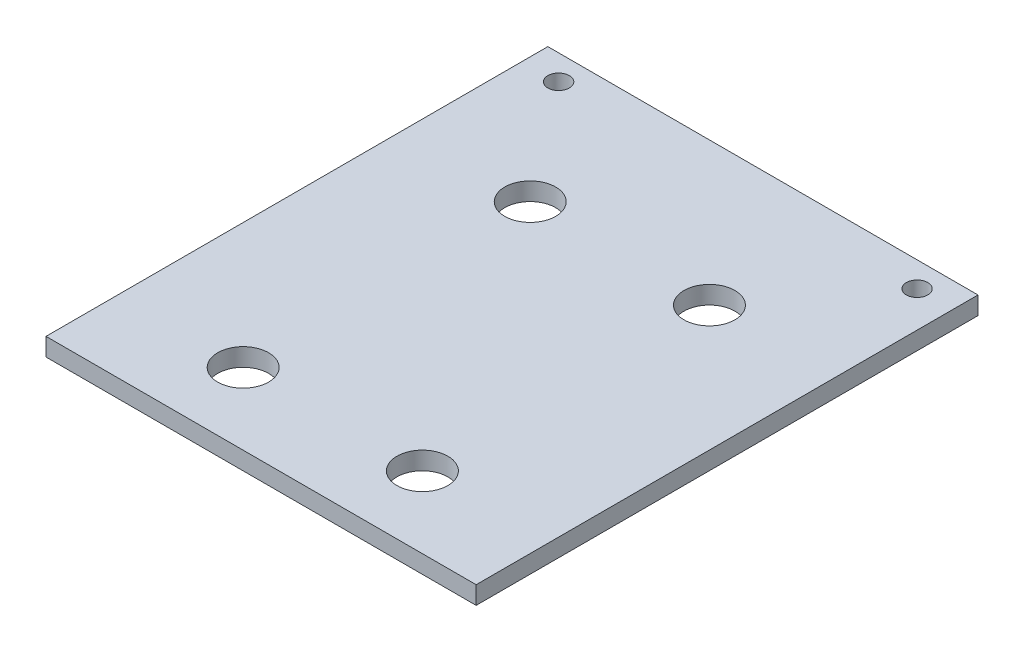
ISO-10303-21;
HEADER;
FILE_DESCRIPTION(('STEP AP214'),'2;1');
FILE_NAME('part.step','',(''),(''),'','','');
FILE_SCHEMA(('AUTOMOTIVE_DESIGN { 1 0 10303 214 1 1 1 1 }'));
ENDSEC;
DATA;
#1=APPLICATION_CONTEXT('core data for automotive mechanical design processes');
#2=APPLICATION_PROTOCOL_DEFINITION('international standard','automotive_design',2000,#1);
#3=PRODUCT_CONTEXT('',#1,'mechanical');
#4=PRODUCT('Part','Part','',(#3));
#5=PRODUCT_RELATED_PRODUCT_CATEGORY('part','',(#4));
#6=PRODUCT_DEFINITION_FORMATION('','',#4);
#7=PRODUCT_DEFINITION_CONTEXT('part definition',#1,'design');
#8=PRODUCT_DEFINITION('design','',#6,#7);
#9=PRODUCT_DEFINITION_SHAPE('','',#8);
#10=(LENGTH_UNIT() NAMED_UNIT(*) SI_UNIT(.MILLI.,.METRE.));
#11=(NAMED_UNIT(*) PLANE_ANGLE_UNIT() SI_UNIT($,.RADIAN.));
#12=(NAMED_UNIT(*) SI_UNIT($,.STERADIAN.) SOLID_ANGLE_UNIT());
#13=UNCERTAINTY_MEASURE_WITH_UNIT(LENGTH_MEASURE(1.E-05),#10,'distance_accuracy_value','');
#14=(GEOMETRIC_REPRESENTATION_CONTEXT(3) GLOBAL_UNCERTAINTY_ASSIGNED_CONTEXT((#13)) GLOBAL_UNIT_ASSIGNED_CONTEXT((#10,
#11,#12)) REPRESENTATION_CONTEXT('',''));
#15=CARTESIAN_POINT('',(0.,0.,0.));
#16=DIRECTION('',(0.,0.,1.));
#17=DIRECTION('',(1.,0.,0.));
#18=AXIS2_PLACEMENT_3D('',#15,#16,#17);
#19=CARTESIAN_POINT('',(270.686802699557,-5.52072275462075E-07,-961.648321554076));
#20=DIRECTION('',(0.,3.042032403755E-09,1.));
#21=DIRECTION('',(1.,0.,0.));
#22=AXIS2_PLACEMENT_3D('',#19,#20,#21);
#23=PLANE('',#22);
#24=DIRECTION('',(1.,0.,0.));
#25=VECTOR('',#24,1.);
#26=CARTESIAN_POINT('',(270.686802699557,-5.52072275462075E-07,-961.648321554076));
#27=LINE('',#26,#25);
#28=CARTESIAN_POINT('',(270.686802699557,-5.52072275462075E-07,-961.648321554076));
#29=VERTEX_POINT('',#28);
#30=CARTESIAN_POINT('',(330.686802699557,-5.5207188699399E-07,-961.648321554076));
#31=VERTEX_POINT('',#30);
#32=EDGE_CURVE('E121',#29,#31,#27,.T.);
#33=ORIENTED_EDGE('',*,*,#32,.T.);
#34=DIRECTION('',(0.,1.,-3.042032403755E-09));
#35=VECTOR('',#34,1.);
#36=CARTESIAN_POINT('',(330.686802699557,-5.5207188699399E-07,-961.648321554076));
#37=LINE('',#36,#35);
#38=CARTESIAN_POINT('',(330.686802699557,2.49999944792811,-961.648321561681));
#39=VERTEX_POINT('',#38);
#40=EDGE_CURVE('E11',#31,#39,#37,.T.);
#41=ORIENTED_EDGE('',*,*,#40,.T.);
#42=DIRECTION('',(1.,0.,0.));
#43=VECTOR('',#42,1.);
#44=CARTESIAN_POINT('',(270.686802699557,2.49999944792772,-961.648321561681));
#45=LINE('',#44,#43);
#46=CARTESIAN_POINT('',(270.686802699557,2.49999944792772,-961.648321561681));
#47=VERTEX_POINT('',#46);
#48=EDGE_CURVE('E184',#47,#39,#45,.T.);
#49=ORIENTED_EDGE('',*,*,#48,.F.);
#50=DIRECTION('',(0.,1.,-3.042032403755E-09));
#51=VECTOR('',#50,1.);
#52=CARTESIAN_POINT('',(270.686802699557,-5.52072275462075E-07,-961.648321554076));
#53=LINE('',#52,#51);
#54=EDGE_CURVE('E135',#29,#47,#53,.T.);
#55=ORIENTED_EDGE('',*,*,#54,.F.);
#56=EDGE_LOOP('',(#33,#41,#49,#55));
#57=FACE_BOUND('',#56,.T.);
#58=ADVANCED_FACE('F16',(#57),#23,.T.);
#59=CARTESIAN_POINT('',(330.686802699557,-5.5207188699399E-07,-961.648321554076));
#60=DIRECTION('',(1.,0.,0.));
#61=DIRECTION('',(0.,1.,0.));
#62=AXIS2_PLACEMENT_3D('',#59,#60,#61);
#63=PLANE('',#62);
#64=DIRECTION('',(0.,-3.0420622324176E-09,-1.));
#65=VECTOR('',#64,1.);
#66=CARTESIAN_POINT('',(330.686802699557,-5.5207188699399E-07,-961.648321554076));
#67=LINE('',#66,#65);
#68=CARTESIAN_POINT('',(330.686802699557,-7.65016243263223E-07,-1031.64832155408));
#69=VERTEX_POINT('',#68);
#70=EDGE_CURVE('E139',#31,#69,#67,.T.);
#71=ORIENTED_EDGE('',*,*,#70,.T.);
#72=DIRECTION('',(0.,1.,-3.04207787849009E-09));
#73=VECTOR('',#72,1.);
#74=CARTESIAN_POINT('',(330.686802699557,-7.65016243263223E-07,-1031.64832155408));
#75=LINE('',#74,#73);
#76=CARTESIAN_POINT('',(330.686802699557,2.49999923498376,-1031.64832156168));
#77=VERTEX_POINT('',#76);
#78=EDGE_CURVE('E27',#69,#77,#75,.T.);
#79=ORIENTED_EDGE('',*,*,#78,.T.);
#80=DIRECTION('',(0.,-3.04206223386163E-09,-1.));
#81=VECTOR('',#80,1.);
#82=CARTESIAN_POINT('',(330.686802699557,2.49999944792811,-961.648321561681));
#83=LINE('',#82,#81);
#84=EDGE_CURVE('E157',#39,#77,#83,.T.);
#85=ORIENTED_EDGE('',*,*,#84,.F.);
#86=ORIENTED_EDGE('',*,*,#40,.F.);
#87=EDGE_LOOP('',(#71,#79,#85,#86));
#88=FACE_BOUND('',#87,.T.);
#89=ADVANCED_FACE('F196',(#88),#63,.T.);
#90=CARTESIAN_POINT('',(330.686802699557,-7.65016243263223E-07,-1031.64832155408));
#91=DIRECTION('',(0.,-3.04207787849009E-09,-1.));
#92=DIRECTION('',(0.,-1.,3.04207787849009E-09));
#93=AXIS2_PLACEMENT_3D('',#90,#91,#92);
#94=PLANE('',#93);
#95=DIRECTION('',(-1.,0.,0.));
#96=VECTOR('',#95,1.);
#97=CARTESIAN_POINT('',(330.686802699557,-7.65016243263223E-07,-1031.64832155408));
#98=LINE('',#97,#96);
#99=CARTESIAN_POINT('',(270.686802699557,-7.65016631731307E-07,-1031.64832155408));
#100=VERTEX_POINT('',#99);
#101=EDGE_CURVE('E127',#69,#100,#98,.T.);
#102=ORIENTED_EDGE('',*,*,#101,.T.);
#103=DIRECTION('',(0.,1.,-3.04207787849009E-09));
#104=VECTOR('',#103,1.);
#105=CARTESIAN_POINT('',(270.686802699557,-7.65016631731307E-07,-1031.64832155408));
#106=LINE('',#105,#104);
#107=CARTESIAN_POINT('',(270.686802699557,2.49999923498337,-1031.64832156168));
#108=VERTEX_POINT('',#107);
#109=EDGE_CURVE('E148',#100,#108,#106,.T.);
#110=ORIENTED_EDGE('',*,*,#109,.T.);
#111=DIRECTION('',(-1.,0.,0.));
#112=VECTOR('',#111,1.);
#113=CARTESIAN_POINT('',(330.686802699557,2.49999923498376,-1031.64832156168));
#114=LINE('',#113,#112);
#115=EDGE_CURVE('E153',#77,#108,#114,.T.);
#116=ORIENTED_EDGE('',*,*,#115,.F.);
#117=ORIENTED_EDGE('',*,*,#78,.F.);
#118=EDGE_LOOP('',(#102,#110,#116,#117));
#119=FACE_BOUND('',#118,.T.);
#120=ADVANCED_FACE('F275',(#119),#94,.T.);
#121=CARTESIAN_POINT('',(270.686802699557,-7.65016631731307E-07,-1031.64832155408));
#122=DIRECTION('',(-1.,0.,0.));
#123=DIRECTION('',(0.,1.,0.));
#124=AXIS2_PLACEMENT_3D('',#121,#122,#123);
#125=PLANE('',#124);
#126=DIRECTION('',(0.,3.0420622324176E-09,1.));
#127=VECTOR('',#126,1.);
#128=CARTESIAN_POINT('',(270.686802699557,-7.65016631731307E-07,-1031.64832155408));
#129=LINE('',#128,#127);
#130=EDGE_CURVE('E123',#100,#29,#129,.T.);
#131=ORIENTED_EDGE('',*,*,#130,.T.);
#132=ORIENTED_EDGE('',*,*,#54,.T.);
#133=DIRECTION('',(0.,3.04206223386163E-09,1.));
#134=VECTOR('',#133,1.);
#135=CARTESIAN_POINT('',(270.686802699557,2.49999923498337,-1031.64832156168));
#136=LINE('',#135,#134);
#137=EDGE_CURVE('E156',#108,#47,#136,.T.);
#138=ORIENTED_EDGE('',*,*,#137,.F.);
#139=ORIENTED_EDGE('',*,*,#109,.F.);
#140=EDGE_LOOP('',(#131,#132,#138,#139));
#141=FACE_BOUND('',#140,.T.);
#142=ADVANCED_FACE('F286',(#141),#125,.T.);
#143=CARTESIAN_POINT('',(288.186802701903,-5.82492784483059E-07,-971.648321554076));
#144=DIRECTION('',(0.,1.,-3.0420622324176E-09));
#145=DIRECTION('',(1.,0.,0.));
#146=AXIS2_PLACEMENT_3D('',#143,#144,#145);
#147=CYLINDRICAL_SURFACE('',#146,3.55);
#148=CARTESIAN_POINT('',(288.186802701903,2.49999941750722,-971.648321561681));
#149=DIRECTION('',(0.,-1.,3.0420622324176E-09));
#150=DIRECTION('',(1.,0.,0.));
#151=AXIS2_PLACEMENT_3D('',#148,#149,#150);
#152=CIRCLE('',#151,3.55);
#153=CARTESIAN_POINT('',(291.736802701903,2.49999941750724,-971.648321561681));
#154=VERTEX_POINT('',#153);
#155=EDGE_CURVE('E162',#154,#154,#152,.T.);
#156=ORIENTED_EDGE('',*,*,#155,.F.);
#157=EDGE_LOOP('',(#156));
#158=FACE_BOUND('',#157,.T.);
#159=CARTESIAN_POINT('',(288.186802701903,-5.82492784483059E-07,-971.648321554076));
#160=DIRECTION('',(0.,1.,-3.0420622324176E-09));
#161=DIRECTION('',(1.,0.,0.));
#162=AXIS2_PLACEMENT_3D('',#159,#160,#161);
#163=CIRCLE('',#162,3.55);
#164=CARTESIAN_POINT('',(291.736802701903,-5.82492761498697E-07,-971.648321554076));
#165=VERTEX_POINT('',#164);
#166=EDGE_CURVE('E161',#165,#165,#163,.T.);
#167=ORIENTED_EDGE('',*,*,#166,.F.);
#168=EDGE_LOOP('',(#167));
#169=FACE_BOUND('',#168,.T.);
#170=ADVANCED_FACE('F18',(#158,#169),#147,.F.);
#171=CARTESIAN_POINT('',(313.186802697211,-5.82491141563196E-07,-971.647834694161));
#172=DIRECTION('',(0.,1.,-3.0420622324176E-09));
#173=DIRECTION('',(1.,0.,0.));
#174=AXIS2_PLACEMENT_3D('',#171,#172,#173);
#175=CYLINDRICAL_SURFACE('',#174,3.55);
#176=CARTESIAN_POINT('',(313.186802697211,2.49999941750886,-971.647834701766));
#177=DIRECTION('',(0.,-1.,3.0420622324176E-09));
#178=DIRECTION('',(1.,0.,0.));
#179=AXIS2_PLACEMENT_3D('',#176,#177,#178);
#180=CIRCLE('',#179,3.55);
#181=CARTESIAN_POINT('',(316.736802697211,2.49999941750888,-971.647834701766));
#182=VERTEX_POINT('',#181);
#183=EDGE_CURVE('E117',#182,#182,#180,.T.);
#184=ORIENTED_EDGE('',*,*,#183,.F.);
#185=EDGE_LOOP('',(#184));
#186=FACE_BOUND('',#185,.T.);
#187=CARTESIAN_POINT('',(313.186802697211,-5.82491141563196E-07,-971.647834694161));
#188=DIRECTION('',(0.,1.,-3.0420622324176E-09));
#189=DIRECTION('',(1.,0.,0.));
#190=AXIS2_PLACEMENT_3D('',#187,#188,#189);
#191=CIRCLE('',#190,3.55);
#192=CARTESIAN_POINT('',(316.736802697211,-5.82491118578835E-07,-971.647834694161));
#193=VERTEX_POINT('',#192);
#194=EDGE_CURVE('E159',#193,#193,#191,.T.);
#195=ORIENTED_EDGE('',*,*,#194,.F.);
#196=EDGE_LOOP('',(#195));
#197=FACE_BOUND('',#196,.T.);
#198=ADVANCED_FACE('F256',(#186,#197),#175,.F.);
#199=CARTESIAN_POINT('',(288.186802701903,-7.04296958450018E-07,-1011.68832227101));
#200=DIRECTION('',(0.,1.,-3.0420622324176E-09));
#201=DIRECTION('',(1.,0.,0.));
#202=AXIS2_PLACEMENT_3D('',#199,#200,#201);
#203=CYLINDRICAL_SURFACE('',#202,3.55);
#204=CARTESIAN_POINT('',(288.186802701903,2.49999929570304,-1011.68832227862));
#205=DIRECTION('',(0.,-1.,3.0420622324176E-09));
#206=DIRECTION('',(1.,0.,0.));
#207=AXIS2_PLACEMENT_3D('',#204,#205,#206);
#208=CIRCLE('',#207,3.55);
#209=CARTESIAN_POINT('',(291.736802701903,2.49999929570306,-1011.68832227862));
#210=VERTEX_POINT('',#209);
#211=EDGE_CURVE('E110',#210,#210,#208,.T.);
#212=ORIENTED_EDGE('',*,*,#211,.F.);
#213=EDGE_LOOP('',(#212));
#214=FACE_BOUND('',#213,.T.);
#215=CARTESIAN_POINT('',(288.186802701903,-7.04296958450018E-07,-1011.68832227101));
#216=DIRECTION('',(0.,1.,-3.0420622324176E-09));
#217=DIRECTION('',(1.,0.,0.));
#218=AXIS2_PLACEMENT_3D('',#215,#216,#217);
#219=CIRCLE('',#218,3.55);
#220=CARTESIAN_POINT('',(291.736802701903,-7.04296935465656E-07,-1011.68832227101));
#221=VERTEX_POINT('',#220);
#222=EDGE_CURVE('E142',#221,#221,#219,.T.);
#223=ORIENTED_EDGE('',*,*,#222,.F.);
#224=EDGE_LOOP('',(#223));
#225=FACE_BOUND('',#224,.T.);
#226=ADVANCED_FACE('F253',(#214,#225),#203,.F.);
#227=CARTESIAN_POINT('',(313.186802697211,-7.0429397251677E-07,-1011.68739392986));
#228=DIRECTION('',(0.,1.,-3.0420622324176E-09));
#229=DIRECTION('',(1.,0.,0.));
#230=AXIS2_PLACEMENT_3D('',#227,#228,#229);
#231=CYLINDRICAL_SURFACE('',#230,3.55);
#232=CARTESIAN_POINT('',(313.186802697211,2.49999929570603,-1011.68739393747));
#233=DIRECTION('',(0.,-1.,3.0420622324176E-09));
#234=DIRECTION('',(1.,0.,0.));
#235=AXIS2_PLACEMENT_3D('',#232,#233,#234);
#236=CIRCLE('',#235,3.55);
#237=CARTESIAN_POINT('',(316.736802697211,2.49999929570605,-1011.68739393747));
#238=VERTEX_POINT('',#237);
#239=EDGE_CURVE('E105',#238,#238,#236,.T.);
#240=ORIENTED_EDGE('',*,*,#239,.F.);
#241=EDGE_LOOP('',(#240));
#242=FACE_BOUND('',#241,.T.);
#243=CARTESIAN_POINT('',(313.186802697211,-7.0429397251677E-07,-1011.68739392986));
#244=DIRECTION('',(0.,1.,-3.0420622324176E-09));
#245=DIRECTION('',(1.,0.,0.));
#246=AXIS2_PLACEMENT_3D('',#243,#244,#245);
#247=CIRCLE('',#246,3.55);
#248=CARTESIAN_POINT('',(316.736802697211,-7.04293949532408E-07,-1011.68739392986));
#249=VERTEX_POINT('',#248);
#250=EDGE_CURVE('E132',#249,#249,#247,.T.);
#251=ORIENTED_EDGE('',*,*,#250,.F.);
#252=EDGE_LOOP('',(#251));
#253=FACE_BOUND('',#252,.T.);
#254=ADVANCED_FACE('F255',(#242,#253),#231,.F.);
#255=CARTESIAN_POINT('',(325.686802699557,-7.54369057822101E-07,-1028.14832155408));
#256=DIRECTION('',(0.,1.,-3.0420622324176E-09));
#257=DIRECTION('',(1.,0.,0.));
#258=AXIS2_PLACEMENT_3D('',#255,#256,#257);
#259=CYLINDRICAL_SURFACE('',#258,1.5);
#260=CARTESIAN_POINT('',(325.686802699557,2.49999924563094,-1028.14832156168));
#261=DIRECTION('',(0.,-1.,3.0420622324176E-09));
#262=DIRECTION('',(1.,0.,0.));
#263=AXIS2_PLACEMENT_3D('',#260,#261,#262);
#264=CIRCLE('',#263,1.5);
#265=CARTESIAN_POINT('',(327.186802699557,2.49999924563095,-1028.14832156168));
#266=VERTEX_POINT('',#265);
#267=EDGE_CURVE('E20',#266,#266,#264,.T.);
#268=ORIENTED_EDGE('',*,*,#267,.F.);
#269=EDGE_LOOP('',(#268));
#270=FACE_BOUND('',#269,.T.);
#271=CARTESIAN_POINT('',(325.686802699557,-7.54369057822101E-07,-1028.14832155408));
#272=DIRECTION('',(0.,1.,-3.0420622324176E-09));
#273=DIRECTION('',(1.,0.,0.));
#274=AXIS2_PLACEMENT_3D('',#271,#272,#273);
#275=CIRCLE('',#274,1.5);
#276=CARTESIAN_POINT('',(327.186802699557,-7.54369048110399E-07,-1028.14832155408));
#277=VERTEX_POINT('',#276);
#278=EDGE_CURVE('E128',#277,#277,#275,.T.);
#279=ORIENTED_EDGE('',*,*,#278,.F.);
#280=EDGE_LOOP('',(#279));
#281=FACE_BOUND('',#280,.T.);
#282=ADVANCED_FACE('F264',(#270,#281),#259,.F.);
#283=CARTESIAN_POINT('',(275.686802699557,-7.54369381545505E-07,-1028.14832155408));
#284=DIRECTION('',(0.,1.,-3.0420622324176E-09));
#285=DIRECTION('',(1.,0.,0.));
#286=AXIS2_PLACEMENT_3D('',#283,#284,#285);
#287=CYLINDRICAL_SURFACE('',#286,1.5);
#288=CARTESIAN_POINT('',(275.686802699557,2.49999924563062,-1028.14832156168));
#289=DIRECTION('',(0.,-1.,3.0420622324176E-09));
#290=DIRECTION('',(1.,0.,0.));
#291=AXIS2_PLACEMENT_3D('',#288,#289,#290);
#292=CIRCLE('',#291,1.5);
#293=CARTESIAN_POINT('',(277.186802699557,2.49999924563063,-1028.14832156168));
#294=VERTEX_POINT('',#293);
#295=EDGE_CURVE('E39',#294,#294,#292,.T.);
#296=ORIENTED_EDGE('',*,*,#295,.F.);
#297=EDGE_LOOP('',(#296));
#298=FACE_BOUND('',#297,.T.);
#299=CARTESIAN_POINT('',(275.686802699557,-7.54369381545505E-07,-1028.14832155408));
#300=DIRECTION('',(0.,1.,-3.0420622324176E-09));
#301=DIRECTION('',(1.,0.,0.));
#302=AXIS2_PLACEMENT_3D('',#299,#300,#301);
#303=CIRCLE('',#302,1.5);
#304=CARTESIAN_POINT('',(277.186802699557,-7.54369371833803E-07,-1028.14832155408));
#305=VERTEX_POINT('',#304);
#306=EDGE_CURVE('E131',#305,#305,#303,.T.);
#307=ORIENTED_EDGE('',*,*,#306,.F.);
#308=EDGE_LOOP('',(#307));
#309=FACE_BOUND('',#308,.T.);
#310=ADVANCED_FACE('F281',(#298,#309),#287,.F.);
#311=CARTESIAN_POINT('',(0.,2.50000237332001,-7.60515579613397E-09));
#312=DIRECTION('',(0.,1.,-3.0420622324176E-09));
#313=DIRECTION('',(-0.999999999997735,0.,2.12831545873828E-06));
#314=AXIS2_PLACEMENT_3D('',#311,#312,#313);
#315=PLANE('',#314);
#316=ORIENTED_EDGE('',*,*,#295,.T.);
#317=EDGE_LOOP('',(#316));
#318=FACE_BOUND('',#317,.T.);
#319=ORIENTED_EDGE('',*,*,#267,.T.);
#320=EDGE_LOOP('',(#319));
#321=FACE_BOUND('',#320,.T.);
#322=ORIENTED_EDGE('',*,*,#239,.T.);
#323=EDGE_LOOP('',(#322));
#324=FACE_BOUND('',#323,.T.);
#325=ORIENTED_EDGE('',*,*,#211,.T.);
#326=EDGE_LOOP('',(#325));
#327=FACE_BOUND('',#326,.T.);
#328=ORIENTED_EDGE('',*,*,#183,.T.);
#329=EDGE_LOOP('',(#328));
#330=FACE_BOUND('',#329,.T.);
#331=ORIENTED_EDGE('',*,*,#155,.T.);
#332=EDGE_LOOP('',(#331));
#333=FACE_BOUND('',#332,.T.);
#334=ORIENTED_EDGE('',*,*,#48,.T.);
#335=ORIENTED_EDGE('',*,*,#84,.T.);
#336=ORIENTED_EDGE('',*,*,#115,.T.);
#337=ORIENTED_EDGE('',*,*,#137,.T.);
#338=EDGE_LOOP('',(#334,#335,#336,#337));
#339=FACE_BOUND('',#338,.T.);
#340=ADVANCED_FACE('F106',(#318,#321,#324,#327,#330,#333,#339),#315,.T.);
#341=CARTESIAN_POINT('',(0.,2.37332001185229E-06,0.));
#342=DIRECTION('',(0.,1.,-3.0420622324176E-09));
#343=DIRECTION('',(-0.999999999997735,0.,2.12831545873828E-06));
#344=AXIS2_PLACEMENT_3D('',#341,#342,#343);
#345=PLANE('',#344);
#346=ORIENTED_EDGE('',*,*,#306,.T.);
#347=EDGE_LOOP('',(#346));
#348=FACE_BOUND('',#347,.T.);
#349=ORIENTED_EDGE('',*,*,#278,.T.);
#350=EDGE_LOOP('',(#349));
#351=FACE_BOUND('',#350,.T.);
#352=ORIENTED_EDGE('',*,*,#250,.T.);
#353=EDGE_LOOP('',(#352));
#354=FACE_BOUND('',#353,.T.);
#355=ORIENTED_EDGE('',*,*,#222,.T.);
#356=EDGE_LOOP('',(#355));
#357=FACE_BOUND('',#356,.T.);
#358=ORIENTED_EDGE('',*,*,#194,.T.);
#359=EDGE_LOOP('',(#358));
#360=FACE_BOUND('',#359,.T.);
#361=ORIENTED_EDGE('',*,*,#166,.T.);
#362=EDGE_LOOP('',(#361));
#363=FACE_BOUND('',#362,.T.);
#364=ORIENTED_EDGE('',*,*,#130,.F.);
#365=ORIENTED_EDGE('',*,*,#101,.F.);
#366=ORIENTED_EDGE('',*,*,#70,.F.);
#367=ORIENTED_EDGE('',*,*,#32,.F.);
#368=EDGE_LOOP('',(#364,#365,#366,#367));
#369=FACE_BOUND('',#368,.T.);
#370=ADVANCED_FACE('F238',(#348,#351,#354,#357,#360,#363,#369),#345,.F.);
#371=CLOSED_SHELL('',(#58,#89,#120,#142,#170,#198,#226,#254,#282,#310,#340,#370));
#372=MANIFOLD_SOLID_BREP('B1',#371);
#373=ADVANCED_BREP_SHAPE_REPRESENTATION('',(#18,#372),#14);
#374=SHAPE_DEFINITION_REPRESENTATION(#9,#373);
ENDSEC;
END-ISO-10303-21;
